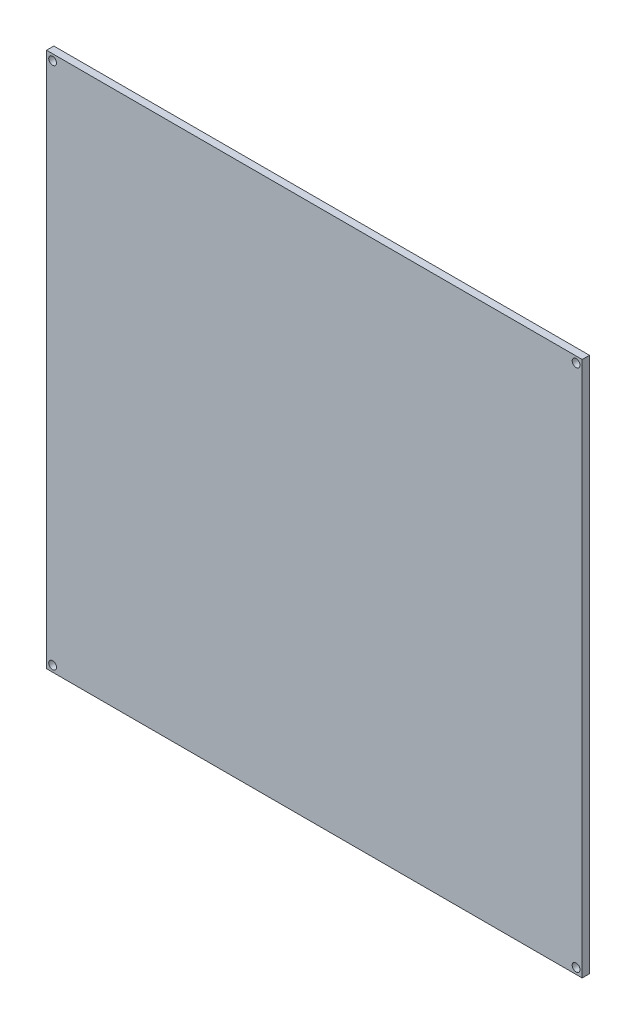
ISO-10303-21;
HEADER;
FILE_DESCRIPTION(('STEP AP214'),'2;1');
FILE_NAME('part.step','',(''),(''),'','','');
FILE_SCHEMA(('AUTOMOTIVE_DESIGN { 1 0 10303 214 1 1 1 1 }'));
ENDSEC;
DATA;
#1=APPLICATION_CONTEXT('core data for automotive mechanical design processes');
#2=APPLICATION_PROTOCOL_DEFINITION('international standard','automotive_design',2000,#1);
#3=PRODUCT_CONTEXT('',#1,'mechanical');
#4=PRODUCT('Part','Part','',(#3));
#5=PRODUCT_RELATED_PRODUCT_CATEGORY('part','',(#4));
#6=PRODUCT_DEFINITION_FORMATION('','',#4);
#7=PRODUCT_DEFINITION_CONTEXT('part definition',#1,'design');
#8=PRODUCT_DEFINITION('design','',#6,#7);
#9=PRODUCT_DEFINITION_SHAPE('','',#8);
#10=(LENGTH_UNIT() NAMED_UNIT(*) SI_UNIT(.MILLI.,.METRE.));
#11=(NAMED_UNIT(*) PLANE_ANGLE_UNIT() SI_UNIT($,.RADIAN.));
#12=(NAMED_UNIT(*) SI_UNIT($,.STERADIAN.) SOLID_ANGLE_UNIT());
#13=UNCERTAINTY_MEASURE_WITH_UNIT(LENGTH_MEASURE(1.E-05),#10,'distance_accuracy_value','');
#14=(GEOMETRIC_REPRESENTATION_CONTEXT(3) GLOBAL_UNCERTAINTY_ASSIGNED_CONTEXT((#13)) GLOBAL_UNIT_ASSIGNED_CONTEXT((#10,
#11,#12)) REPRESENTATION_CONTEXT('',''));
#15=CARTESIAN_POINT('',(0.,0.,0.));
#16=DIRECTION('',(0.,0.,1.));
#17=DIRECTION('',(1.,0.,0.));
#18=AXIS2_PLACEMENT_3D('',#15,#16,#17);
#19=CARTESIAN_POINT('',(0.,0.,3.));
#20=DIRECTION('',(0.,0.,-1.));
#21=DIRECTION('',(-1.,0.,0.));
#22=AXIS2_PLACEMENT_3D('',#19,#20,#21);
#23=PLANE('',#22);
#24=DIRECTION('',(0.,1.,0.));
#25=VECTOR('',#24,1.);
#26=CARTESIAN_POINT('',(110.,-110.,3.));
#27=LINE('',#26,#25);
#28=CARTESIAN_POINT('',(110.,-110.,3.));
#29=VERTEX_POINT('',#28);
#30=CARTESIAN_POINT('',(110.,110.,3.));
#31=VERTEX_POINT('',#30);
#32=EDGE_CURVE('E87',#29,#31,#27,.T.);
#33=ORIENTED_EDGE('',*,*,#32,.T.);
#34=DIRECTION('',(-1.,0.,0.));
#35=VECTOR('',#34,1.);
#36=CARTESIAN_POINT('',(-110.,110.,3.));
#37=LINE('',#36,#35);
#38=CARTESIAN_POINT('',(-110.,110.,3.));
#39=VERTEX_POINT('',#38);
#40=EDGE_CURVE('E82',#31,#39,#37,.T.);
#41=ORIENTED_EDGE('',*,*,#40,.T.);
#42=DIRECTION('',(0.,-1.,0.));
#43=VECTOR('',#42,1.);
#44=CARTESIAN_POINT('',(-110.,-110.,3.));
#45=LINE('',#44,#43);
#46=CARTESIAN_POINT('',(-110.,-110.,3.));
#47=VERTEX_POINT('',#46);
#48=EDGE_CURVE('E85',#39,#47,#45,.T.);
#49=ORIENTED_EDGE('',*,*,#48,.T.);
#50=DIRECTION('',(1.,0.,0.));
#51=VECTOR('',#50,1.);
#52=CARTESIAN_POINT('',(-110.,-110.,3.));
#53=LINE('',#52,#51);
#54=EDGE_CURVE('E52',#47,#29,#53,.T.);
#55=ORIENTED_EDGE('',*,*,#54,.T.);
#56=EDGE_LOOP('',(#33,#41,#49,#55));
#57=FACE_BOUND('',#56,.T.);
#58=CARTESIAN_POINT('',(-107.5,107.5,3.));
#59=DIRECTION('',(0.,0.,1.));
#60=DIRECTION('',(1.,0.,0.));
#61=AXIS2_PLACEMENT_3D('',#58,#59,#60);
#62=CIRCLE('',#61,1.60000000000001);
#63=CARTESIAN_POINT('',(-105.9,107.5,3.));
#64=VERTEX_POINT('',#63);
#65=EDGE_CURVE('E102',#64,#64,#62,.T.);
#66=ORIENTED_EDGE('',*,*,#65,.F.);
#67=EDGE_LOOP('',(#66));
#68=FACE_BOUND('',#67,.T.);
#69=CARTESIAN_POINT('',(107.5,107.500000000006,3.));
#70=DIRECTION('',(0.,0.,1.));
#71=DIRECTION('',(1.,0.,0.));
#72=AXIS2_PLACEMENT_3D('',#69,#70,#71);
#73=CIRCLE('',#72,1.6000000000063);
#74=CARTESIAN_POINT('',(109.100000000006,107.500000000006,3.));
#75=VERTEX_POINT('',#74);
#76=EDGE_CURVE('E117',#75,#75,#73,.T.);
#77=ORIENTED_EDGE('',*,*,#76,.F.);
#78=EDGE_LOOP('',(#77));
#79=FACE_BOUND('',#78,.T.);
#80=CARTESIAN_POINT('',(107.500000000006,-107.499999999994,3.));
#81=DIRECTION('',(0.,0.,1.));
#82=DIRECTION('',(1.,0.,0.));
#83=AXIS2_PLACEMENT_3D('',#80,#81,#82);
#84=CIRCLE('',#83,1.60000000000862);
#85=CARTESIAN_POINT('',(109.100000000015,-107.499999999994,3.));
#86=VERTEX_POINT('',#85);
#87=EDGE_CURVE('E123',#86,#86,#84,.T.);
#88=ORIENTED_EDGE('',*,*,#87,.F.);
#89=EDGE_LOOP('',(#88));
#90=FACE_BOUND('',#89,.T.);
#91=CARTESIAN_POINT('',(-107.499999999994,-107.5,3.));
#92=DIRECTION('',(0.,0.,1.));
#93=DIRECTION('',(1.,0.,0.));
#94=AXIS2_PLACEMENT_3D('',#91,#92,#93);
#95=CIRCLE('',#94,1.60000000000326);
#96=CARTESIAN_POINT('',(-105.899999999991,-107.5,3.));
#97=VERTEX_POINT('',#96);
#98=EDGE_CURVE('E129',#97,#97,#95,.T.);
#99=ORIENTED_EDGE('',*,*,#98,.F.);
#100=EDGE_LOOP('',(#99));
#101=FACE_BOUND('',#100,.T.);
#102=ADVANCED_FACE('F35',(#57,#68,#79,#90,#101),#23,.F.);
#103=CARTESIAN_POINT('',(0.,0.,0.));
#104=DIRECTION('',(0.,0.,-1.));
#105=DIRECTION('',(-1.,0.,0.));
#106=AXIS2_PLACEMENT_3D('',#103,#104,#105);
#107=PLANE('',#106);
#108=CARTESIAN_POINT('',(107.500000000006,-107.499999999994,0.));
#109=DIRECTION('',(0.,0.,1.));
#110=DIRECTION('',(1.,0.,0.));
#111=AXIS2_PLACEMENT_3D('',#108,#109,#110);
#112=CIRCLE('',#111,1.60000000000862);
#113=CARTESIAN_POINT('',(109.100000000015,-107.499999999994,0.));
#114=VERTEX_POINT('',#113);
#115=EDGE_CURVE('E126',#114,#114,#112,.T.);
#116=ORIENTED_EDGE('',*,*,#115,.T.);
#117=EDGE_LOOP('',(#116));
#118=FACE_BOUND('',#117,.T.);
#119=CARTESIAN_POINT('',(-107.5,107.5,0.));
#120=DIRECTION('',(0.,0.,1.));
#121=DIRECTION('',(1.,0.,0.));
#122=AXIS2_PLACEMENT_3D('',#119,#120,#121);
#123=CIRCLE('',#122,1.60000000000001);
#124=CARTESIAN_POINT('',(-105.9,107.5,0.));
#125=VERTEX_POINT('',#124);
#126=EDGE_CURVE('E114',#125,#125,#123,.T.);
#127=ORIENTED_EDGE('',*,*,#126,.T.);
#128=EDGE_LOOP('',(#127));
#129=FACE_BOUND('',#128,.T.);
#130=DIRECTION('',(0.,1.,0.));
#131=VECTOR('',#130,1.);
#132=CARTESIAN_POINT('',(110.,-110.,0.));
#133=LINE('',#132,#131);
#134=CARTESIAN_POINT('',(110.,-110.,0.));
#135=VERTEX_POINT('',#134);
#136=CARTESIAN_POINT('',(110.,110.,0.));
#137=VERTEX_POINT('',#136);
#138=EDGE_CURVE('E99',#135,#137,#133,.T.);
#139=ORIENTED_EDGE('',*,*,#138,.F.);
#140=DIRECTION('',(1.,0.,0.));
#141=VECTOR('',#140,1.);
#142=CARTESIAN_POINT('',(-110.,-110.,0.));
#143=LINE('',#142,#141);
#144=CARTESIAN_POINT('',(-110.,-110.,0.));
#145=VERTEX_POINT('',#144);
#146=EDGE_CURVE('E75',#145,#135,#143,.T.);
#147=ORIENTED_EDGE('',*,*,#146,.F.);
#148=DIRECTION('',(0.,-1.,0.));
#149=VECTOR('',#148,1.);
#150=CARTESIAN_POINT('',(-110.,-110.,0.));
#151=LINE('',#150,#149);
#152=CARTESIAN_POINT('',(-110.,110.,0.));
#153=VERTEX_POINT('',#152);
#154=EDGE_CURVE('E69',#153,#145,#151,.T.);
#155=ORIENTED_EDGE('',*,*,#154,.F.);
#156=DIRECTION('',(-1.,0.,0.));
#157=VECTOR('',#156,1.);
#158=CARTESIAN_POINT('',(-110.,110.,0.));
#159=LINE('',#158,#157);
#160=EDGE_CURVE('E91',#137,#153,#159,.T.);
#161=ORIENTED_EDGE('',*,*,#160,.F.);
#162=EDGE_LOOP('',(#139,#147,#155,#161));
#163=FACE_BOUND('',#162,.T.);
#164=CARTESIAN_POINT('',(107.5,107.500000000006,0.));
#165=DIRECTION('',(0.,0.,1.));
#166=DIRECTION('',(1.,0.,0.));
#167=AXIS2_PLACEMENT_3D('',#164,#165,#166);
#168=CIRCLE('',#167,1.6000000000063);
#169=CARTESIAN_POINT('',(109.100000000006,107.500000000006,0.));
#170=VERTEX_POINT('',#169);
#171=EDGE_CURVE('E120',#170,#170,#168,.T.);
#172=ORIENTED_EDGE('',*,*,#171,.T.);
#173=EDGE_LOOP('',(#172));
#174=FACE_BOUND('',#173,.T.);
#175=CARTESIAN_POINT('',(-107.499999999994,-107.5,0.));
#176=DIRECTION('',(0.,0.,1.));
#177=DIRECTION('',(1.,0.,0.));
#178=AXIS2_PLACEMENT_3D('',#175,#176,#177);
#179=CIRCLE('',#178,1.60000000000326);
#180=CARTESIAN_POINT('',(-105.899999999991,-107.5,0.));
#181=VERTEX_POINT('',#180);
#182=EDGE_CURVE('E132',#181,#181,#179,.T.);
#183=ORIENTED_EDGE('',*,*,#182,.T.);
#184=EDGE_LOOP('',(#183));
#185=FACE_BOUND('',#184,.T.);
#186=ADVANCED_FACE('F110',(#118,#129,#163,#174,#185),#107,.T.);
#187=CARTESIAN_POINT('',(110.,-110.,3.));
#188=DIRECTION('',(-1.,0.,0.));
#189=DIRECTION('',(0.,0.,1.));
#190=AXIS2_PLACEMENT_3D('',#187,#188,#189);
#191=PLANE('',#190);
#192=ORIENTED_EDGE('',*,*,#138,.T.);
#193=DIRECTION('',(0.,0.,-1.));
#194=VECTOR('',#193,1.);
#195=CARTESIAN_POINT('',(110.,110.,3.));
#196=LINE('',#195,#194);
#197=EDGE_CURVE('E11',#31,#137,#196,.T.);
#198=ORIENTED_EDGE('',*,*,#197,.F.);
#199=ORIENTED_EDGE('',*,*,#32,.F.);
#200=DIRECTION('',(0.,0.,-1.));
#201=VECTOR('',#200,1.);
#202=CARTESIAN_POINT('',(110.,-110.,3.));
#203=LINE('',#202,#201);
#204=EDGE_CURVE('E95',#29,#135,#203,.T.);
#205=ORIENTED_EDGE('',*,*,#204,.T.);
#206=EDGE_LOOP('',(#192,#198,#199,#205));
#207=FACE_BOUND('',#206,.T.);
#208=ADVANCED_FACE('F37',(#207),#191,.F.);
#209=CARTESIAN_POINT('',(-110.,110.,3.));
#210=DIRECTION('',(0.,-1.,0.));
#211=DIRECTION('',(0.,0.,-1.));
#212=AXIS2_PLACEMENT_3D('',#209,#210,#211);
#213=PLANE('',#212);
#214=ORIENTED_EDGE('',*,*,#160,.T.);
#215=DIRECTION('',(0.,0.,-1.));
#216=VECTOR('',#215,1.);
#217=CARTESIAN_POINT('',(-110.,110.,3.));
#218=LINE('',#217,#216);
#219=EDGE_CURVE('E44',#39,#153,#218,.T.);
#220=ORIENTED_EDGE('',*,*,#219,.F.);
#221=ORIENTED_EDGE('',*,*,#40,.F.);
#222=ORIENTED_EDGE('',*,*,#197,.T.);
#223=EDGE_LOOP('',(#214,#220,#221,#222));
#224=FACE_BOUND('',#223,.T.);
#225=ADVANCED_FACE('F90',(#224),#213,.F.);
#226=CARTESIAN_POINT('',(-110.,-110.,3.));
#227=DIRECTION('',(1.,0.,0.));
#228=DIRECTION('',(0.,0.,-1.));
#229=AXIS2_PLACEMENT_3D('',#226,#227,#228);
#230=PLANE('',#229);
#231=ORIENTED_EDGE('',*,*,#154,.T.);
#232=DIRECTION('',(0.,0.,-1.));
#233=VECTOR('',#232,1.);
#234=CARTESIAN_POINT('',(-110.,-110.,3.));
#235=LINE('',#234,#233);
#236=EDGE_CURVE('E92',#47,#145,#235,.T.);
#237=ORIENTED_EDGE('',*,*,#236,.F.);
#238=ORIENTED_EDGE('',*,*,#48,.F.);
#239=ORIENTED_EDGE('',*,*,#219,.T.);
#240=EDGE_LOOP('',(#231,#237,#238,#239));
#241=FACE_BOUND('',#240,.T.);
#242=ADVANCED_FACE('F93',(#241),#230,.F.);
#243=CARTESIAN_POINT('',(-110.,-110.,3.));
#244=DIRECTION('',(0.,1.,0.));
#245=DIRECTION('',(0.,0.,1.));
#246=AXIS2_PLACEMENT_3D('',#243,#244,#245);
#247=PLANE('',#246);
#248=ORIENTED_EDGE('',*,*,#146,.T.);
#249=ORIENTED_EDGE('',*,*,#204,.F.);
#250=ORIENTED_EDGE('',*,*,#54,.F.);
#251=ORIENTED_EDGE('',*,*,#236,.T.);
#252=EDGE_LOOP('',(#248,#249,#250,#251));
#253=FACE_BOUND('',#252,.T.);
#254=ADVANCED_FACE('F107',(#253),#247,.F.);
#255=CARTESIAN_POINT('',(-107.5,107.5,3.));
#256=DIRECTION('',(0.,0.,-1.));
#257=DIRECTION('',(-1.,0.,0.));
#258=AXIS2_PLACEMENT_3D('',#255,#256,#257);
#259=CYLINDRICAL_SURFACE('',#258,1.60000000000001);
#260=ORIENTED_EDGE('',*,*,#65,.T.);
#261=EDGE_LOOP('',(#260));
#262=FACE_BOUND('',#261,.T.);
#263=ORIENTED_EDGE('',*,*,#126,.F.);
#264=EDGE_LOOP('',(#263));
#265=FACE_BOUND('',#264,.T.);
#266=ADVANCED_FACE('F149',(#262,#265),#259,.F.);
#267=CARTESIAN_POINT('',(107.5,107.500000000006,3.));
#268=DIRECTION('',(0.,0.,-1.));
#269=DIRECTION('',(-1.,0.,0.));
#270=AXIS2_PLACEMENT_3D('',#267,#268,#269);
#271=CYLINDRICAL_SURFACE('',#270,1.6000000000063);
#272=ORIENTED_EDGE('',*,*,#76,.T.);
#273=EDGE_LOOP('',(#272));
#274=FACE_BOUND('',#273,.T.);
#275=ORIENTED_EDGE('',*,*,#171,.F.);
#276=EDGE_LOOP('',(#275));
#277=FACE_BOUND('',#276,.T.);
#278=ADVANCED_FACE('F195',(#274,#277),#271,.F.);
#279=CARTESIAN_POINT('',(107.500000000006,-107.499999999994,3.));
#280=DIRECTION('',(0.,0.,-1.));
#281=DIRECTION('',(-1.,0.,0.));
#282=AXIS2_PLACEMENT_3D('',#279,#280,#281);
#283=CYLINDRICAL_SURFACE('',#282,1.60000000000862);
#284=ORIENTED_EDGE('',*,*,#87,.T.);
#285=EDGE_LOOP('',(#284));
#286=FACE_BOUND('',#285,.T.);
#287=ORIENTED_EDGE('',*,*,#115,.F.);
#288=EDGE_LOOP('',(#287));
#289=FACE_BOUND('',#288,.T.);
#290=ADVANCED_FACE('F203',(#286,#289),#283,.F.);
#291=CARTESIAN_POINT('',(-107.499999999994,-107.5,3.));
#292=DIRECTION('',(0.,0.,-1.));
#293=DIRECTION('',(-1.,0.,0.));
#294=AXIS2_PLACEMENT_3D('',#291,#292,#293);
#295=CYLINDRICAL_SURFACE('',#294,1.60000000000326);
#296=ORIENTED_EDGE('',*,*,#98,.T.);
#297=EDGE_LOOP('',(#296));
#298=FACE_BOUND('',#297,.T.);
#299=ORIENTED_EDGE('',*,*,#182,.F.);
#300=EDGE_LOOP('',(#299));
#301=FACE_BOUND('',#300,.T.);
#302=ADVANCED_FACE('F138',(#298,#301),#295,.F.);
#303=CLOSED_SHELL('',(#102,#186,#208,#225,#242,#254,#266,#278,#290,#302));
#304=MANIFOLD_SOLID_BREP('B2',#303);
#305=ADVANCED_BREP_SHAPE_REPRESENTATION('',(#18,#304),#14);
#306=SHAPE_DEFINITION_REPRESENTATION(#9,#305);
ENDSEC;
END-ISO-10303-21;
